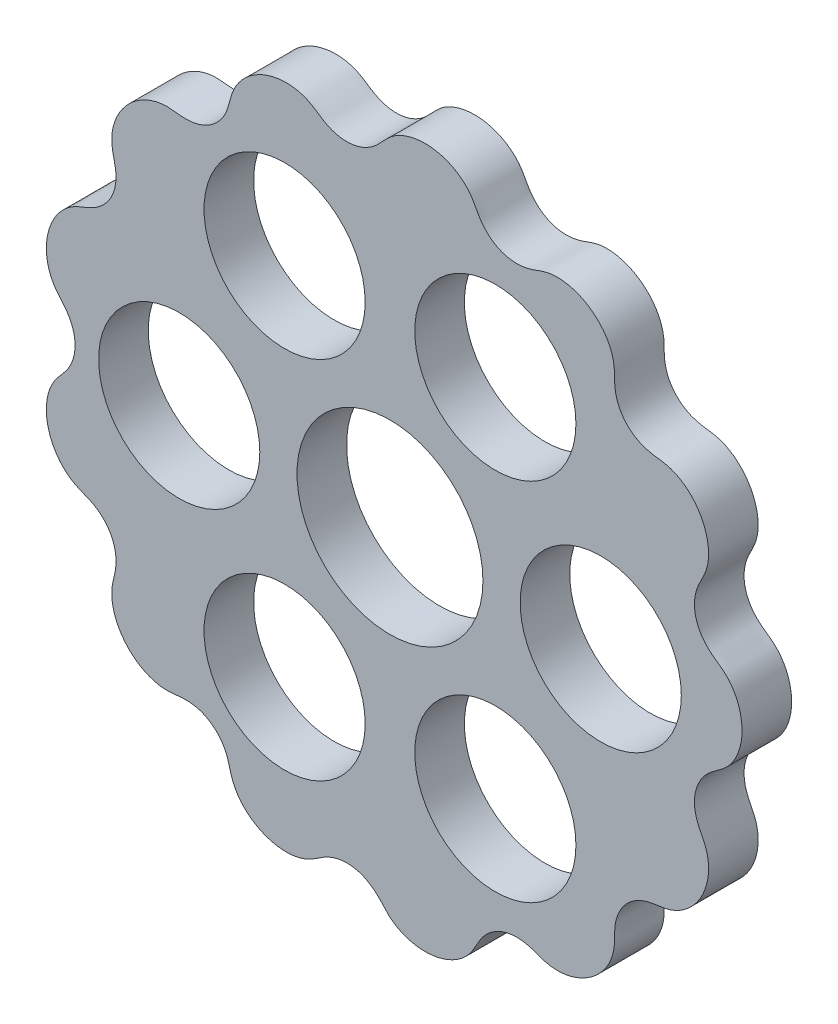
ISO-10303-21;
HEADER;
FILE_DESCRIPTION(('STEP AP214'),'2;1');
FILE_NAME('part.step','',(''),(''),'','','');
FILE_SCHEMA(('AUTOMOTIVE_DESIGN { 1 0 10303 214 1 1 1 1 }'));
ENDSEC;
DATA;
#1=APPLICATION_CONTEXT('core data for automotive mechanical design processes');
#2=APPLICATION_PROTOCOL_DEFINITION('international standard','automotive_design',2000,#1);
#3=PRODUCT_CONTEXT('',#1,'mechanical');
#4=PRODUCT('Part','Part','',(#3));
#5=PRODUCT_RELATED_PRODUCT_CATEGORY('part','',(#4));
#6=PRODUCT_DEFINITION_FORMATION('','',#4);
#7=PRODUCT_DEFINITION_CONTEXT('part definition',#1,'design');
#8=PRODUCT_DEFINITION('design','',#6,#7);
#9=PRODUCT_DEFINITION_SHAPE('','',#8);
#10=(LENGTH_UNIT() NAMED_UNIT(*) SI_UNIT(.MILLI.,.METRE.));
#11=(NAMED_UNIT(*) PLANE_ANGLE_UNIT() SI_UNIT($,.RADIAN.));
#12=(NAMED_UNIT(*) SI_UNIT($,.STERADIAN.) SOLID_ANGLE_UNIT());
#13=UNCERTAINTY_MEASURE_WITH_UNIT(LENGTH_MEASURE(1.E-05),#10,'distance_accuracy_value','');
#14=(GEOMETRIC_REPRESENTATION_CONTEXT(3) GLOBAL_UNCERTAINTY_ASSIGNED_CONTEXT((#13)) GLOBAL_UNIT_ASSIGNED_CONTEXT((#10,
#11,#12)) REPRESENTATION_CONTEXT('',''));
#15=CARTESIAN_POINT('',(0.,0.,0.));
#16=DIRECTION('',(0.,0.,1.));
#17=DIRECTION('',(1.,0.,0.));
#18=AXIS2_PLACEMENT_3D('',#15,#16,#17);
#19=CARTESIAN_POINT('',(0.,0.,-2.));
#20=DIRECTION('',(0.,0.,1.));
#21=DIRECTION('',(1.,0.,0.));
#22=AXIS2_PLACEMENT_3D('',#19,#20,#21);
#23=CYLINDRICAL_SURFACE('',#22,7.5);
#24=CARTESIAN_POINT('',(0.,0.,-2.));
#25=DIRECTION('',(0.,0.,1.));
#26=DIRECTION('',(1.,0.,0.));
#27=AXIS2_PLACEMENT_3D('',#24,#25,#26);
#28=CIRCLE('',#27,7.5);
#29=CARTESIAN_POINT('',(7.5,0.,-2.));
#30=VERTEX_POINT('',#29);
#31=EDGE_CURVE('E46',#30,#30,#28,.T.);
#32=ORIENTED_EDGE('',*,*,#31,.F.);
#33=EDGE_LOOP('',(#32));
#34=FACE_BOUND('',#33,.T.);
#35=CARTESIAN_POINT('',(0.,0.,2.));
#36=DIRECTION('',(0.,0.,1.));
#37=DIRECTION('',(1.,0.,0.));
#38=AXIS2_PLACEMENT_3D('',#35,#36,#37);
#39=CIRCLE('',#38,7.5);
#40=CARTESIAN_POINT('',(7.5,0.,2.));
#41=VERTEX_POINT('',#40);
#42=EDGE_CURVE('E54',#41,#41,#39,.T.);
#43=ORIENTED_EDGE('',*,*,#42,.T.);
#44=EDGE_LOOP('',(#43));
#45=FACE_BOUND('',#44,.T.);
#46=ADVANCED_FACE('F37',(#34,#45),#23,.F.);
#47=CARTESIAN_POINT('',(28.4,0.,-2.));
#48=CARTESIAN_POINT('',(28.4,0.494018077281395,-2.));
#49=CARTESIAN_POINT('',(28.2517724346192,1.48205423184421,-2.));
#50=CARTESIAN_POINT('',(27.6940320593812,2.59998380389546,-2.));
#51=CARTESIAN_POINT('',(27.0326537341155,3.33330206625649,-2.));
#52=CARTESIAN_POINT('',(26.4327038249563,3.76639091586571,-2.));
#53=CARTESIAN_POINT('',(25.8028305162469,4.21167996453306,-2.));
#54=CARTESIAN_POINT('',(25.0819444237052,4.96360035052576,-2.));
#55=CARTESIAN_POINT('',(24.5147666867307,6.17058970948249,-2.));
#56=CARTESIAN_POINT('',(24.5501305270848,7.50250682094075,-2.));
#57=CARTESIAN_POINT('',(24.9011449356945,8.48137310770468,-2.));
#58=CARTESIAN_POINT('',(25.2701093406554,9.14903736477961,-2.));
#59=CARTESIAN_POINT('',(25.5567310805582,9.82708911151464,-2.));
#60=CARTESIAN_POINT('',(25.7457657256968,10.7977462594145,-2.));
#61=CARTESIAN_POINT('',(25.6569104299972,12.0433792911543,-2.));
#62=CARTESIAN_POINT('',(25.1003773725293,13.4350656708568,-2.));
#63=CARTESIAN_POINT('',(24.1598672226639,14.601149783571,-2.));
#64=CARTESIAN_POINT('',(23.1091287756582,15.28026952895,-2.));
#65=CARTESIAN_POINT('',(22.165863427164,15.5619447413085,-2.));
#66=CARTESIAN_POINT('',(21.4207175620141,15.6381577607555,-2.));
#67=CARTESIAN_POINT('',(20.6571861407886,15.7805884524401,-2.));
#68=CARTESIAN_POINT('',(19.6916581459578,16.1744363515132,-2.));
#69=CARTESIAN_POINT('',(18.6880160972355,17.0542141669908,-2.));
#70=CARTESIAN_POINT('',(18.1853283232136,18.28671261616,-2.));
#71=CARTESIAN_POINT('',(18.1047484392748,19.3204651168975,-2.));
#72=CARTESIAN_POINT('',(18.1303586449653,20.3218599615977,-2.));
#73=CARTESIAN_POINT('',(17.8205598125879,21.52380408712,-2.));
#74=CARTESIAN_POINT('',(16.9646785406964,22.7589951275974,-2.));
#75=CARTESIAN_POINT('',(15.7829219409689,23.6790016408428,-2.));
#76=CARTESIAN_POINT('',(14.3819461383799,24.2090092367497,-2.));
#77=CARTESIAN_POINT('',(13.1300926865018,24.2577596435127,-2.));
#78=CARTESIAN_POINT('',(12.1810863494968,24.0046717733021,-2.));
#79=CARTESIAN_POINT('',(11.2435829984023,23.6187020546368,-2.));
#80=CARTESIAN_POINT('',(9.93167918205197,23.4168336593233,-2.));
#81=CARTESIAN_POINT('',(8.40531468409649,23.9059532038584,-2.));
#82=CARTESIAN_POINT('',(7.2536008003107,25.0202156753736,-2.));
#83=CARTESIAN_POINT('',(6.65781073486349,26.4352536418206,-2.));
#84=CARTESIAN_POINT('',(5.58550411767659,27.4731005514271,-2.));
#85=CARTESIAN_POINT('',(4.22473642780317,28.1054807821007,-2.));
#86=CARTESIAN_POINT('',(2.73931808605094,28.3034126928115,-2.));
#87=CARTESIAN_POINT('',(1.26309861730961,28.0487911923057,-2.));
#88=CARTESIAN_POINT('',(-0.0579384495987002,27.3398073977258,-2.));
#89=CARTESIAN_POINT('',(-0.972568048774349,26.1195473090616,-2.));
#90=CARTESIAN_POINT('',(-2.32031564634968,25.259891663065,-2.));
#91=CARTESIAN_POINT('',(-3.91610980276082,25.0965211150815,-2.));
#92=CARTESIAN_POINT('',(-5.16043650832356,25.5604944507025,-2.));
#93=CARTESIAN_POINT('',(-5.98983150818873,26.1551322010955,-2.));
#94=CARTESIAN_POINT('',(-6.83460851609718,26.6572297679366,-2.));
#95=CARTESIAN_POINT('',(-8.05482579975422,26.9417243532921,-2.));
#96=CARTESIAN_POINT('',(-9.54574239600177,26.7977513229155,-2.));
#97=CARTESIAN_POINT('',(-10.9268195391618,26.2189467191188,-2.));
#98=CARTESIAN_POINT('',(-12.0777775140771,25.2512532424679,-2.));
#99=CARTESIAN_POINT('',(-12.8192772328903,23.9644998701697,-2.));
#100=CARTESIAN_POINT('',(-13.0669075977899,22.4403810481019,-2.));
#101=CARTESIAN_POINT('',(-13.9736727882185,21.1129791788216,-2.));
#102=CARTESIAN_POINT('',(-15.1331537094872,20.4578046976219,-2.));
#103=CARTESIAN_POINT('',(-16.1602585199246,20.2726481980158,-2.));
#104=CARTESIAN_POINT('',(-16.9382994951821,20.2939433020603,-2.));
#105=CARTESIAN_POINT('',(-17.6847015044038,20.4048737956405,-2.));
#106=CARTESIAN_POINT('',(-18.6675217294585,20.3903379666938,-2.));
#107=CARTESIAN_POINT('',(-19.8612942479327,20.0124067043544,-2.));
#108=CARTESIAN_POINT('',(-21.0742363187852,19.1337367020819,-2.));
#109=CARTESIAN_POINT('',(-21.9753199349905,17.9359794512057,-2.));
#110=CARTESIAN_POINT('',(-22.3893575732058,16.7577106123276,-2.));
#111=CARTESIAN_POINT('',(-22.4656166365364,15.7717338631668,-2.));
#112=CARTESIAN_POINT('',(-22.3747024945202,15.0410950336727,-2.));
#113=CARTESIAN_POINT('',(-22.1737358919923,14.3107334085974,-2.));
#114=CARTESIAN_POINT('',(-22.0351275137155,13.2814882691664,-2.));
#115=CARTESIAN_POINT('',(-22.273967408101,11.9712983230022,-2.));
#116=CARTESIAN_POINT('',(-23.0763170300469,10.9053690535316,-2.));
#117=CARTESIAN_POINT('',(-23.9384383727396,10.319681802801,-2.));
#118=CARTESIAN_POINT('',(-24.6522536039025,10.0193729925573,-2.));
#119=CARTESIAN_POINT('',(-25.348564350697,9.75736724708988,-2.));
#120=CARTESIAN_POINT('',(-26.1817744874132,9.22998043071449,-2.));
#121=CARTESIAN_POINT('',(-27.0153137200926,8.29834863411906,-2.));
#122=CARTESIAN_POINT('',(-27.6177348048837,6.92636825511127,-2.));
#123=CARTESIAN_POINT('',(-27.7909028854273,5.43763049361172,-2.));
#124=CARTESIAN_POINT('',(-27.5480338575396,4.212558351681,-2.));
#125=CARTESIAN_POINT('',(-27.1069278033468,3.32798364018357,-2.));
#126=CARTESIAN_POINT('',(-26.6464688922434,2.75215312610548,-2.));
#127=CARTESIAN_POINT('',(-26.1327199887346,2.18195069299585,-2.));
#128=CARTESIAN_POINT('',(-25.5847273042694,1.29696627175968,-2.));
#129=CARTESIAN_POINT('',(-25.2768484638204,0.,-2.));
#130=CARTESIAN_POINT('',(-25.5847273042694,-1.29696627175966,-2.));
#131=CARTESIAN_POINT('',(-26.1327199887346,-2.18195069299582,-2.));
#132=CARTESIAN_POINT('',(-26.6464688922433,-2.75215312610543,-2.));
#133=CARTESIAN_POINT('',(-27.1069278033468,-3.32798364018352,-2.));
#134=CARTESIAN_POINT('',(-27.5480338575396,-4.21255835168104,-2.));
#135=CARTESIAN_POINT('',(-27.7909028854273,-5.43763049361169,-2.));
#136=CARTESIAN_POINT('',(-27.6177348048837,-6.92636825511128,-2.));
#137=CARTESIAN_POINT('',(-27.0153137200926,-8.29834863411904,-2.));
#138=CARTESIAN_POINT('',(-26.1817744874132,-9.22998043071452,-2.));
#139=CARTESIAN_POINT('',(-25.348564350697,-9.75736724708987,-2.));
#140=CARTESIAN_POINT('',(-24.6522536039025,-10.0193729925573,-2.));
#141=CARTESIAN_POINT('',(-23.9384383727395,-10.319681802801,-2.));
#142=CARTESIAN_POINT('',(-23.0763170300469,-10.9053690535316,-2.));
#143=CARTESIAN_POINT('',(-22.273967408101,-11.9712983230022,-2.));
#144=CARTESIAN_POINT('',(-22.0351275137155,-13.2814882691664,-2.));
#145=CARTESIAN_POINT('',(-22.1737358919923,-14.3107334085974,-2.));
#146=CARTESIAN_POINT('',(-22.3747024945202,-15.0410950336727,-2.));
#147=CARTESIAN_POINT('',(-22.4656166365364,-15.7717338631668,-2.));
#148=CARTESIAN_POINT('',(-22.3893575732058,-16.7577106123276,-2.));
#149=CARTESIAN_POINT('',(-21.9753199349905,-17.9359794512058,-2.));
#150=CARTESIAN_POINT('',(-21.0742363187852,-19.1337367020819,-2.));
#151=CARTESIAN_POINT('',(-19.8612942479327,-20.0124067043545,-2.));
#152=CARTESIAN_POINT('',(-18.6675217294584,-20.3903379666938,-2.));
#153=CARTESIAN_POINT('',(-17.6847015044037,-20.4048737956405,-2.));
#154=CARTESIAN_POINT('',(-16.9382994951821,-20.2939433020603,-2.));
#155=CARTESIAN_POINT('',(-16.1602585199246,-20.2726481980158,-2.));
#156=CARTESIAN_POINT('',(-15.1331537094871,-20.4578046976219,-2.));
#157=CARTESIAN_POINT('',(-13.9736727882184,-21.1129791788216,-2.));
#158=CARTESIAN_POINT('',(-13.0669075977899,-22.440381048102,-2.));
#159=CARTESIAN_POINT('',(-12.8192772328902,-23.9644998701698,-2.));
#160=CARTESIAN_POINT('',(-12.0777775140771,-25.2512532424679,-2.));
#161=CARTESIAN_POINT('',(-10.9268195391617,-26.2189467191188,-2.));
#162=CARTESIAN_POINT('',(-9.54574239600168,-26.7977513229155,-2.));
#163=CARTESIAN_POINT('',(-8.05482579975419,-26.9417243532921,-2.));
#164=CARTESIAN_POINT('',(-6.83460851609709,-26.6572297679366,-2.));
#165=CARTESIAN_POINT('',(-5.98983150818869,-26.1551322010954,-2.));
#166=CARTESIAN_POINT('',(-5.16043650832355,-25.5604944507025,-2.));
#167=CARTESIAN_POINT('',(-3.91610980276076,-25.0965211150815,-2.));
#168=CARTESIAN_POINT('',(-2.32031564634966,-25.259891663065,-2.));
#169=CARTESIAN_POINT('',(-0.972568048774323,-26.1195473090616,-2.));
#170=CARTESIAN_POINT('',(-0.0579384495986571,-27.3398073977258,-2.));
#171=CARTESIAN_POINT('',(1.26309861730962,-28.0487911923057,-2.));
#172=CARTESIAN_POINT('',(2.73931808605102,-28.3034126928115,-2.));
#173=CARTESIAN_POINT('',(4.22473642780324,-28.1054807821007,-2.));
#174=CARTESIAN_POINT('',(5.58550411767664,-27.473100551427,-2.));
#175=CARTESIAN_POINT('',(6.65781073486357,-26.4352536418205,-2.));
#176=CARTESIAN_POINT('',(7.25360080031074,-25.0202156753735,-2.));
#177=CARTESIAN_POINT('',(8.40531468409658,-23.9059532038583,-2.));
#178=CARTESIAN_POINT('',(9.93167918205204,-23.4168336593232,-2.));
#179=CARTESIAN_POINT('',(11.2435829984024,-23.6187020546369,-2.));
#180=CARTESIAN_POINT('',(12.1810863494969,-24.0046717733021,-2.));
#181=CARTESIAN_POINT('',(13.1300926865019,-24.2577596435128,-2.));
#182=CARTESIAN_POINT('',(14.38194613838,-24.2090092367497,-2.));
#183=CARTESIAN_POINT('',(15.782921940969,-23.6790016408428,-2.));
#184=CARTESIAN_POINT('',(16.9646785406965,-22.7589951275973,-2.));
#185=CARTESIAN_POINT('',(17.820559812588,-21.5238040871198,-2.));
#186=CARTESIAN_POINT('',(18.1303586449652,-20.3218599615976,-2.));
#187=CARTESIAN_POINT('',(18.1047484392748,-19.3204651168975,-2.));
#188=CARTESIAN_POINT('',(18.1853283232136,-18.2867126161599,-2.));
#189=CARTESIAN_POINT('',(18.6880160972356,-17.0542141669908,-2.));
#190=CARTESIAN_POINT('',(19.6916581459579,-16.1744363515132,-2.));
#191=CARTESIAN_POINT('',(20.6571861407887,-15.7805884524401,-2.));
#192=CARTESIAN_POINT('',(21.4207175620142,-15.6381577607554,-2.));
#193=CARTESIAN_POINT('',(22.1658634271641,-15.5619447413085,-2.));
#194=CARTESIAN_POINT('',(23.1091287756582,-15.28026952895,-2.));
#195=CARTESIAN_POINT('',(24.1598672226639,-14.601149783571,-2.));
#196=CARTESIAN_POINT('',(25.1003773725293,-13.4350656708568,-2.));
#197=CARTESIAN_POINT('',(25.6569104299971,-12.0433792911542,-2.));
#198=CARTESIAN_POINT('',(25.7457657256968,-10.7977462594146,-2.));
#199=CARTESIAN_POINT('',(25.5567310805582,-9.82708911151456,-2.));
#200=CARTESIAN_POINT('',(25.2701093406554,-9.1490373647796,-2.));
#201=CARTESIAN_POINT('',(24.9011449356945,-8.48137310770465,-2.));
#202=CARTESIAN_POINT('',(24.5501305270848,-7.50250682094073,-2.));
#203=CARTESIAN_POINT('',(24.5147666867307,-6.17058970948242,-2.));
#204=CARTESIAN_POINT('',(25.0819444237052,-4.96360035052574,-2.));
#205=CARTESIAN_POINT('',(25.802830516247,-4.21167996453302,-2.));
#206=CARTESIAN_POINT('',(26.4327038249564,-3.76639091586571,-2.));
#207=CARTESIAN_POINT('',(27.0326537341156,-3.33330206625644,-2.));
#208=CARTESIAN_POINT('',(27.6940320593811,-2.59998380389545,-2.));
#209=CARTESIAN_POINT('',(28.2517724346192,-1.48205423184416,-2.));
#210=CARTESIAN_POINT('',(28.4,-0.494018077281395,-2.));
#211=CARTESIAN_POINT('',(28.4,0.,-2.));
#212=B_SPLINE_CURVE_WITH_KNOTS('',3,(#47,#48,#49,#50,#51,#52,#53,#54,#55,#56,#57,#58,#59,#60,
#61,#62,#63,#64,#65,#66,#67,#68,#69,#70,#71,#72,#73,#74,#75,#76,#77,#78,#79,#80,#81,#82,#83,#84,
#85,#86,#87,#88,#89,#90,#91,#92,#93,#94,#95,#96,#97,#98,#99,#100,#101,#102,#103,#104,#105,#106,
#107,#108,#109,#110,#111,#112,#113,#114,#115,#116,#117,#118,#119,#120,#121,#122,#123,#124,#125,
#126,#127,#128,#129,#130,#131,#132,#133,#134,#135,#136,#137,#138,#139,#140,#141,#142,#143,#144,
#145,#146,#147,#148,#149,#150,#151,#152,#153,#154,#155,#156,#157,#158,#159,#160,#161,#162,#163,
#164,#165,#166,#167,#168,#169,#170,#171,#172,#173,#174,#175,#176,#177,#178,#179,#180,#181,#182,
#183,#184,#185,#186,#187,#188,#189,#190,#191,#192,#193,#194,#195,#196,#197,#198,#199,#200,#201,
#202,#203,#204,#205,#206,#207,#208,#209,#210,#211),.UNSPECIFIED.,.T.,.F.,(4,1,1,1,1,1,1,1,1,1,1,
1,1,1,1,1,1,1,1,1,1,1,1,1,1,1,1,1,1,1,1,1,1,1,1,1,1,1,1,1,1,1,1,1,1,1,1,1,1,1,1,1,1,1,1,1,1,1,1,
1,1,1,1,1,1,1,1,1,1,1,1,1,1,1,1,1,1,1,1,1,1,1,1,1,1,1,1,1,1,1,1,1,1,1,1,1,1,1,1,1,1,1,1,1,1,1,1,
1,1,1,1,1,1,1,1,1,1,1,1,1,1,1,1,1,1,1,1,1,1,1,1,1,1,1,1,1,1,1,1,1,1,1,1,1,1,1,1,1,1,1,1,1,1,1,1,
1,1,1,1,1,1,1,4),(0.,0.0078125,0.015625,0.01953125,0.0234375,0.02734375,0.03125,0.0390625,
0.046875,0.05078125,0.0546875,0.05859375,0.0625,0.0703125,0.078125,0.0859375,0.09375,0.09765625,
0.1015625,0.10546875,0.109375,0.1171875,0.125,0.12890625,0.1328125,0.140625,0.1484375,0.15625,
0.1640625,0.171875,0.17578125,0.1796875,0.1875,0.1953125,0.203125,0.2109375,0.21875,0.2265625,
0.234375,0.2421875,0.25,0.2578125,0.265625,0.2734375,0.28125,0.28515625,0.2890625,0.296875,
0.3046875,0.3125,0.3203125,0.328125,0.3359375,0.34375,0.3515625,0.35546875,0.359375,0.36328125,
0.3671875,0.375,0.3828125,0.390625,0.3984375,0.40234375,0.40625,0.41015625,0.4140625,0.421875,
0.4296875,0.43359375,0.4375,0.44140625,0.4453125,0.453125,0.4609375,0.46875,0.4765625,
0.48046875,0.484375,0.48828125,0.4921875,0.5,0.5078125,0.51171875,0.515625,0.51953125,0.5234375,
0.53125,0.5390625,0.546875,0.5546875,0.55859375,0.5625,0.56640625,0.5703125,0.578125,0.5859375,
0.58984375,0.59375,0.59765625,0.6015625,0.609375,0.6171875,0.625,0.6328125,0.63671875,0.640625,
0.64453125,0.6484375,0.65625,0.6640625,0.671875,0.6796875,0.6875,0.6953125,0.703125,0.7109375,
0.71484375,0.71875,0.7265625,0.734375,0.7421875,0.75,0.7578125,0.765625,0.7734375,0.78125,
0.7890625,0.796875,0.8046875,0.8125,0.8203125,0.82421875,0.828125,0.8359375,0.84375,0.8515625,
0.859375,0.8671875,0.87109375,0.875,0.8828125,0.890625,0.89453125,0.8984375,0.90234375,0.90625,
0.9140625,0.921875,0.9296875,0.9375,0.94140625,0.9453125,0.94921875,0.953125,0.9609375,0.96875,
0.97265625,0.9765625,0.98046875,0.984375,0.9921875,1.),.UNSPECIFIED.);
#213=DIRECTION('',(0.,0.,1.));
#214=VECTOR('',#213,1.);
#215=SURFACE_OF_LINEAR_EXTRUSION('',#212,#214);
#216=CARTESIAN_POINT('',(28.4,0.,-2.));
#217=VERTEX_POINT('',#216);
#218=EDGE_CURVE('E10',#217,#217,#212,.T.);
#219=ORIENTED_EDGE('',*,*,#218,.T.);
#220=EDGE_LOOP('',(#219));
#221=FACE_BOUND('',#220,.T.);
#222=CARTESIAN_POINT('',(28.4,0.,2.));
#223=CARTESIAN_POINT('',(28.4,0.494018077281395,2.));
#224=CARTESIAN_POINT('',(28.2517724346192,1.48205423184421,2.));
#225=CARTESIAN_POINT('',(27.6940320593812,2.59998380389546,2.));
#226=CARTESIAN_POINT('',(27.0326537341155,3.33330206625649,2.));
#227=CARTESIAN_POINT('',(26.4327038249563,3.76639091586571,2.));
#228=CARTESIAN_POINT('',(25.8028305162469,4.21167996453306,2.));
#229=CARTESIAN_POINT('',(25.0819444237052,4.96360035052576,2.));
#230=CARTESIAN_POINT('',(24.5147666867307,6.17058970948249,2.));
#231=CARTESIAN_POINT('',(24.5501305270848,7.50250682094075,2.));
#232=CARTESIAN_POINT('',(24.9011449356945,8.48137310770468,2.));
#233=CARTESIAN_POINT('',(25.2701093406554,9.14903736477961,2.));
#234=CARTESIAN_POINT('',(25.5567310805582,9.82708911151464,2.));
#235=CARTESIAN_POINT('',(25.7457657256968,10.7977462594145,2.));
#236=CARTESIAN_POINT('',(25.6569104299972,12.0433792911543,2.));
#237=CARTESIAN_POINT('',(25.1003773725293,13.4350656708568,2.));
#238=CARTESIAN_POINT('',(24.1598672226639,14.601149783571,2.));
#239=CARTESIAN_POINT('',(23.1091287756582,15.28026952895,2.));
#240=CARTESIAN_POINT('',(22.165863427164,15.5619447413085,2.));
#241=CARTESIAN_POINT('',(21.4207175620141,15.6381577607555,2.));
#242=CARTESIAN_POINT('',(20.6571861407886,15.7805884524401,2.));
#243=CARTESIAN_POINT('',(19.6916581459578,16.1744363515132,2.));
#244=CARTESIAN_POINT('',(18.6880160972355,17.0542141669908,2.));
#245=CARTESIAN_POINT('',(18.1853283232136,18.28671261616,2.));
#246=CARTESIAN_POINT('',(18.1047484392748,19.3204651168975,2.));
#247=CARTESIAN_POINT('',(18.1303586449653,20.3218599615977,2.));
#248=CARTESIAN_POINT('',(17.8205598125879,21.52380408712,2.));
#249=CARTESIAN_POINT('',(16.9646785406964,22.7589951275974,2.));
#250=CARTESIAN_POINT('',(15.7829219409689,23.6790016408428,2.));
#251=CARTESIAN_POINT('',(14.3819461383799,24.2090092367497,2.));
#252=CARTESIAN_POINT('',(13.1300926865018,24.2577596435127,2.));
#253=CARTESIAN_POINT('',(12.1810863494968,24.0046717733021,2.));
#254=CARTESIAN_POINT('',(11.2435829984023,23.6187020546368,2.));
#255=CARTESIAN_POINT('',(9.93167918205197,23.4168336593233,2.));
#256=CARTESIAN_POINT('',(8.40531468409649,23.9059532038584,2.));
#257=CARTESIAN_POINT('',(7.2536008003107,25.0202156753736,2.));
#258=CARTESIAN_POINT('',(6.65781073486349,26.4352536418206,2.));
#259=CARTESIAN_POINT('',(5.58550411767659,27.4731005514271,2.));
#260=CARTESIAN_POINT('',(4.22473642780317,28.1054807821007,2.));
#261=CARTESIAN_POINT('',(2.73931808605094,28.3034126928115,2.));
#262=CARTESIAN_POINT('',(1.26309861730961,28.0487911923057,2.));
#263=CARTESIAN_POINT('',(-0.0579384495987002,27.3398073977258,2.));
#264=CARTESIAN_POINT('',(-0.972568048774349,26.1195473090616,2.));
#265=CARTESIAN_POINT('',(-2.32031564634968,25.259891663065,2.));
#266=CARTESIAN_POINT('',(-3.91610980276082,25.0965211150815,2.));
#267=CARTESIAN_POINT('',(-5.16043650832356,25.5604944507025,2.));
#268=CARTESIAN_POINT('',(-5.98983150818873,26.1551322010955,2.));
#269=CARTESIAN_POINT('',(-6.83460851609718,26.6572297679366,2.));
#270=CARTESIAN_POINT('',(-8.05482579975422,26.9417243532921,2.));
#271=CARTESIAN_POINT('',(-9.54574239600177,26.7977513229155,2.));
#272=CARTESIAN_POINT('',(-10.9268195391618,26.2189467191188,2.));
#273=CARTESIAN_POINT('',(-12.0777775140771,25.2512532424679,2.));
#274=CARTESIAN_POINT('',(-12.8192772328903,23.9644998701697,2.));
#275=CARTESIAN_POINT('',(-13.0669075977899,22.4403810481019,2.));
#276=CARTESIAN_POINT('',(-13.9736727882185,21.1129791788216,2.));
#277=CARTESIAN_POINT('',(-15.1331537094872,20.4578046976219,2.));
#278=CARTESIAN_POINT('',(-16.1602585199246,20.2726481980158,2.));
#279=CARTESIAN_POINT('',(-16.9382994951821,20.2939433020603,2.));
#280=CARTESIAN_POINT('',(-17.6847015044038,20.4048737956405,2.));
#281=CARTESIAN_POINT('',(-18.6675217294585,20.3903379666938,2.));
#282=CARTESIAN_POINT('',(-19.8612942479327,20.0124067043544,2.));
#283=CARTESIAN_POINT('',(-21.0742363187852,19.1337367020819,2.));
#284=CARTESIAN_POINT('',(-21.9753199349905,17.9359794512057,2.));
#285=CARTESIAN_POINT('',(-22.3893575732058,16.7577106123276,2.));
#286=CARTESIAN_POINT('',(-22.4656166365364,15.7717338631668,2.));
#287=CARTESIAN_POINT('',(-22.3747024945202,15.0410950336727,2.));
#288=CARTESIAN_POINT('',(-22.1737358919923,14.3107334085974,2.));
#289=CARTESIAN_POINT('',(-22.0351275137155,13.2814882691664,2.));
#290=CARTESIAN_POINT('',(-22.273967408101,11.9712983230022,2.));
#291=CARTESIAN_POINT('',(-23.0763170300469,10.9053690535316,2.));
#292=CARTESIAN_POINT('',(-23.9384383727396,10.319681802801,2.));
#293=CARTESIAN_POINT('',(-24.6522536039025,10.0193729925573,2.));
#294=CARTESIAN_POINT('',(-25.348564350697,9.75736724708988,2.));
#295=CARTESIAN_POINT('',(-26.1817744874132,9.22998043071449,2.));
#296=CARTESIAN_POINT('',(-27.0153137200926,8.29834863411906,2.));
#297=CARTESIAN_POINT('',(-27.6177348048837,6.92636825511127,2.));
#298=CARTESIAN_POINT('',(-27.7909028854273,5.43763049361172,2.));
#299=CARTESIAN_POINT('',(-27.5480338575396,4.212558351681,2.));
#300=CARTESIAN_POINT('',(-27.1069278033468,3.32798364018357,2.));
#301=CARTESIAN_POINT('',(-26.6464688922434,2.75215312610548,2.));
#302=CARTESIAN_POINT('',(-26.1327199887346,2.18195069299585,2.));
#303=CARTESIAN_POINT('',(-25.5847273042694,1.29696627175968,2.));
#304=CARTESIAN_POINT('',(-25.2768484638204,0.,2.));
#305=CARTESIAN_POINT('',(-25.5847273042694,-1.29696627175966,2.));
#306=CARTESIAN_POINT('',(-26.1327199887346,-2.18195069299582,2.));
#307=CARTESIAN_POINT('',(-26.6464688922433,-2.75215312610543,2.));
#308=CARTESIAN_POINT('',(-27.1069278033468,-3.32798364018352,2.));
#309=CARTESIAN_POINT('',(-27.5480338575396,-4.21255835168104,2.));
#310=CARTESIAN_POINT('',(-27.7909028854273,-5.43763049361169,2.));
#311=CARTESIAN_POINT('',(-27.6177348048837,-6.92636825511128,2.));
#312=CARTESIAN_POINT('',(-27.0153137200926,-8.29834863411904,2.));
#313=CARTESIAN_POINT('',(-26.1817744874132,-9.22998043071452,2.));
#314=CARTESIAN_POINT('',(-25.348564350697,-9.75736724708987,2.));
#315=CARTESIAN_POINT('',(-24.6522536039025,-10.0193729925573,2.));
#316=CARTESIAN_POINT('',(-23.9384383727395,-10.319681802801,2.));
#317=CARTESIAN_POINT('',(-23.0763170300469,-10.9053690535316,2.));
#318=CARTESIAN_POINT('',(-22.273967408101,-11.9712983230022,2.));
#319=CARTESIAN_POINT('',(-22.0351275137155,-13.2814882691664,2.));
#320=CARTESIAN_POINT('',(-22.1737358919923,-14.3107334085974,2.));
#321=CARTESIAN_POINT('',(-22.3747024945202,-15.0410950336727,2.));
#322=CARTESIAN_POINT('',(-22.4656166365364,-15.7717338631668,2.));
#323=CARTESIAN_POINT('',(-22.3893575732058,-16.7577106123276,2.));
#324=CARTESIAN_POINT('',(-21.9753199349905,-17.9359794512058,2.));
#325=CARTESIAN_POINT('',(-21.0742363187852,-19.1337367020819,2.));
#326=CARTESIAN_POINT('',(-19.8612942479327,-20.0124067043545,2.));
#327=CARTESIAN_POINT('',(-18.6675217294584,-20.3903379666938,2.));
#328=CARTESIAN_POINT('',(-17.6847015044037,-20.4048737956405,2.));
#329=CARTESIAN_POINT('',(-16.9382994951821,-20.2939433020603,2.));
#330=CARTESIAN_POINT('',(-16.1602585199246,-20.2726481980158,2.));
#331=CARTESIAN_POINT('',(-15.1331537094871,-20.4578046976219,2.));
#332=CARTESIAN_POINT('',(-13.9736727882184,-21.1129791788216,2.));
#333=CARTESIAN_POINT('',(-13.0669075977899,-22.440381048102,2.));
#334=CARTESIAN_POINT('',(-12.8192772328902,-23.9644998701698,2.));
#335=CARTESIAN_POINT('',(-12.0777775140771,-25.2512532424679,2.));
#336=CARTESIAN_POINT('',(-10.9268195391617,-26.2189467191188,2.));
#337=CARTESIAN_POINT('',(-9.54574239600168,-26.7977513229155,2.));
#338=CARTESIAN_POINT('',(-8.05482579975419,-26.9417243532921,2.));
#339=CARTESIAN_POINT('',(-6.83460851609709,-26.6572297679366,2.));
#340=CARTESIAN_POINT('',(-5.98983150818869,-26.1551322010954,2.));
#341=CARTESIAN_POINT('',(-5.16043650832355,-25.5604944507025,2.));
#342=CARTESIAN_POINT('',(-3.91610980276076,-25.0965211150815,2.));
#343=CARTESIAN_POINT('',(-2.32031564634966,-25.259891663065,2.));
#344=CARTESIAN_POINT('',(-0.972568048774323,-26.1195473090616,2.));
#345=CARTESIAN_POINT('',(-0.0579384495986571,-27.3398073977258,2.));
#346=CARTESIAN_POINT('',(1.26309861730962,-28.0487911923057,2.));
#347=CARTESIAN_POINT('',(2.73931808605102,-28.3034126928115,2.));
#348=CARTESIAN_POINT('',(4.22473642780324,-28.1054807821007,2.));
#349=CARTESIAN_POINT('',(5.58550411767664,-27.473100551427,2.));
#350=CARTESIAN_POINT('',(6.65781073486357,-26.4352536418205,2.));
#351=CARTESIAN_POINT('',(7.25360080031074,-25.0202156753735,2.));
#352=CARTESIAN_POINT('',(8.40531468409658,-23.9059532038583,2.));
#353=CARTESIAN_POINT('',(9.93167918205204,-23.4168336593232,2.));
#354=CARTESIAN_POINT('',(11.2435829984024,-23.6187020546369,2.));
#355=CARTESIAN_POINT('',(12.1810863494969,-24.0046717733021,2.));
#356=CARTESIAN_POINT('',(13.1300926865019,-24.2577596435128,2.));
#357=CARTESIAN_POINT('',(14.38194613838,-24.2090092367497,2.));
#358=CARTESIAN_POINT('',(15.782921940969,-23.6790016408428,2.));
#359=CARTESIAN_POINT('',(16.9646785406965,-22.7589951275973,2.));
#360=CARTESIAN_POINT('',(17.820559812588,-21.5238040871198,2.));
#361=CARTESIAN_POINT('',(18.1303586449652,-20.3218599615976,2.));
#362=CARTESIAN_POINT('',(18.1047484392748,-19.3204651168975,2.));
#363=CARTESIAN_POINT('',(18.1853283232136,-18.2867126161599,2.));
#364=CARTESIAN_POINT('',(18.6880160972356,-17.0542141669908,2.));
#365=CARTESIAN_POINT('',(19.6916581459579,-16.1744363515132,2.));
#366=CARTESIAN_POINT('',(20.6571861407887,-15.7805884524401,2.));
#367=CARTESIAN_POINT('',(21.4207175620142,-15.6381577607554,2.));
#368=CARTESIAN_POINT('',(22.1658634271641,-15.5619447413085,2.));
#369=CARTESIAN_POINT('',(23.1091287756582,-15.28026952895,2.));
#370=CARTESIAN_POINT('',(24.1598672226639,-14.601149783571,2.));
#371=CARTESIAN_POINT('',(25.1003773725293,-13.4350656708568,2.));
#372=CARTESIAN_POINT('',(25.6569104299971,-12.0433792911542,2.));
#373=CARTESIAN_POINT('',(25.7457657256968,-10.7977462594146,2.));
#374=CARTESIAN_POINT('',(25.5567310805582,-9.82708911151456,2.));
#375=CARTESIAN_POINT('',(25.2701093406554,-9.1490373647796,2.));
#376=CARTESIAN_POINT('',(24.9011449356945,-8.48137310770465,2.));
#377=CARTESIAN_POINT('',(24.5501305270848,-7.50250682094073,2.));
#378=CARTESIAN_POINT('',(24.5147666867307,-6.17058970948242,2.));
#379=CARTESIAN_POINT('',(25.0819444237052,-4.96360035052574,2.));
#380=CARTESIAN_POINT('',(25.802830516247,-4.21167996453302,2.));
#381=CARTESIAN_POINT('',(26.4327038249564,-3.76639091586571,2.));
#382=CARTESIAN_POINT('',(27.0326537341156,-3.33330206625644,2.));
#383=CARTESIAN_POINT('',(27.6940320593811,-2.59998380389545,2.));
#384=CARTESIAN_POINT('',(28.2517724346192,-1.48205423184416,2.));
#385=CARTESIAN_POINT('',(28.4,-0.494018077281395,2.));
#386=CARTESIAN_POINT('',(28.4,0.,2.));
#387=B_SPLINE_CURVE_WITH_KNOTS('',3,(#222,#223,#224,#225,#226,#227,#228,#229,#230,#231,#232,
#233,#234,#235,#236,#237,#238,#239,#240,#241,#242,#243,#244,#245,#246,#247,#248,#249,#250,#251,
#252,#253,#254,#255,#256,#257,#258,#259,#260,#261,#262,#263,#264,#265,#266,#267,#268,#269,#270,
#271,#272,#273,#274,#275,#276,#277,#278,#279,#280,#281,#282,#283,#284,#285,#286,#287,#288,#289,
#290,#291,#292,#293,#294,#295,#296,#297,#298,#299,#300,#301,#302,#303,#304,#305,#306,#307,#308,
#309,#310,#311,#312,#313,#314,#315,#316,#317,#318,#319,#320,#321,#322,#323,#324,#325,#326,#327,
#328,#329,#330,#331,#332,#333,#334,#335,#336,#337,#338,#339,#340,#341,#342,#343,#344,#345,#346,
#347,#348,#349,#350,#351,#352,#353,#354,#355,#356,#357,#358,#359,#360,#361,#362,#363,#364,#365,
#366,#367,#368,#369,#370,#371,#372,#373,#374,#375,#376,#377,#378,#379,#380,#381,#382,#383,#384,
#385,#386),.UNSPECIFIED.,.T.,.F.,(4,1,1,1,1,1,1,1,1,1,1,1,1,1,1,1,1,1,1,1,1,1,1,1,1,1,1,1,1,1,1,
1,1,1,1,1,1,1,1,1,1,1,1,1,1,1,1,1,1,1,1,1,1,1,1,1,1,1,1,1,1,1,1,1,1,1,1,1,1,1,1,1,1,1,1,1,1,1,1,
1,1,1,1,1,1,1,1,1,1,1,1,1,1,1,1,1,1,1,1,1,1,1,1,1,1,1,1,1,1,1,1,1,1,1,1,1,1,1,1,1,1,1,1,1,1,1,1,
1,1,1,1,1,1,1,1,1,1,1,1,1,1,1,1,1,1,1,1,1,1,1,1,1,1,1,1,1,1,1,1,1,1,1,4),(0.,0.0078125,0.015625,
0.01953125,0.0234375,0.02734375,0.03125,0.0390625,0.046875,0.05078125,0.0546875,0.05859375,
0.0625,0.0703125,0.078125,0.0859375,0.09375,0.09765625,0.1015625,0.10546875,0.109375,0.1171875,
0.125,0.12890625,0.1328125,0.140625,0.1484375,0.15625,0.1640625,0.171875,0.17578125,0.1796875,
0.1875,0.1953125,0.203125,0.2109375,0.21875,0.2265625,0.234375,0.2421875,0.25,0.2578125,
0.265625,0.2734375,0.28125,0.28515625,0.2890625,0.296875,0.3046875,0.3125,0.3203125,0.328125,
0.3359375,0.34375,0.3515625,0.35546875,0.359375,0.36328125,0.3671875,0.375,0.3828125,0.390625,
0.3984375,0.40234375,0.40625,0.41015625,0.4140625,0.421875,0.4296875,0.43359375,0.4375,
0.44140625,0.4453125,0.453125,0.4609375,0.46875,0.4765625,0.48046875,0.484375,0.48828125,
0.4921875,0.5,0.5078125,0.51171875,0.515625,0.51953125,0.5234375,0.53125,0.5390625,0.546875,
0.5546875,0.55859375,0.5625,0.56640625,0.5703125,0.578125,0.5859375,0.58984375,0.59375,
0.59765625,0.6015625,0.609375,0.6171875,0.625,0.6328125,0.63671875,0.640625,0.64453125,
0.6484375,0.65625,0.6640625,0.671875,0.6796875,0.6875,0.6953125,0.703125,0.7109375,0.71484375,
0.71875,0.7265625,0.734375,0.7421875,0.75,0.7578125,0.765625,0.7734375,0.78125,0.7890625,
0.796875,0.8046875,0.8125,0.8203125,0.82421875,0.828125,0.8359375,0.84375,0.8515625,0.859375,
0.8671875,0.87109375,0.875,0.8828125,0.890625,0.89453125,0.8984375,0.90234375,0.90625,0.9140625,
0.921875,0.9296875,0.9375,0.94140625,0.9453125,0.94921875,0.953125,0.9609375,0.96875,0.97265625,
0.9765625,0.98046875,0.984375,0.9921875,1.),.UNSPECIFIED.);
#388=CARTESIAN_POINT('',(28.4,0.,2.));
#389=VERTEX_POINT('',#388);
#390=EDGE_CURVE('E50',#389,#389,#387,.T.);
#391=ORIENTED_EDGE('',*,*,#390,.F.);
#392=EDGE_LOOP('',(#391));
#393=FACE_BOUND('',#392,.T.);
#394=ADVANCED_FACE('F117',(#221,#393),#215,.T.);
#395=CARTESIAN_POINT('',(0.,0.,-2.));
#396=DIRECTION('',(0.,0.,1.));
#397=DIRECTION('',(1.,0.,0.));
#398=AXIS2_PLACEMENT_3D('',#395,#396,#397);
#399=PLANE('',#398);
#400=CARTESIAN_POINT('',(8.49999999999997,-14.7224318643355,-2.));
#401=DIRECTION('',(0.,0.,1.));
#402=DIRECTION('',(1.,0.,0.));
#403=AXIS2_PLACEMENT_3D('',#400,#401,#402);
#404=CIRCLE('',#403,6.5);
#405=CARTESIAN_POINT('',(15.,-14.7224318643355,-2.));
#406=VERTEX_POINT('',#405);
#407=EDGE_CURVE('E64',#406,#406,#404,.T.);
#408=ORIENTED_EDGE('',*,*,#407,.T.);
#409=EDGE_LOOP('',(#408));
#410=FACE_BOUND('',#409,.T.);
#411=CARTESIAN_POINT('',(-8.50000000000007,-14.7224318643354,-2.));
#412=DIRECTION('',(0.,0.,1.));
#413=DIRECTION('',(1.,0.,0.));
#414=AXIS2_PLACEMENT_3D('',#411,#412,#413);
#415=CIRCLE('',#414,6.5);
#416=CARTESIAN_POINT('',(-2.00000000000007,-14.7224318643354,-2.));
#417=VERTEX_POINT('',#416);
#418=EDGE_CURVE('E67',#417,#417,#415,.T.);
#419=ORIENTED_EDGE('',*,*,#418,.T.);
#420=EDGE_LOOP('',(#419));
#421=FACE_BOUND('',#420,.T.);
#422=CARTESIAN_POINT('',(-17.,1.18710365520667E-13,-2.));
#423=DIRECTION('',(0.,0.,1.));
#424=DIRECTION('',(1.,0.,0.));
#425=AXIS2_PLACEMENT_3D('',#422,#423,#424);
#426=CIRCLE('',#425,6.5);
#427=CARTESIAN_POINT('',(-10.5,1.18710365520667E-13,-2.));
#428=VERTEX_POINT('',#427);
#429=EDGE_CURVE('E70',#428,#428,#426,.T.);
#430=ORIENTED_EDGE('',*,*,#429,.T.);
#431=EDGE_LOOP('',(#430));
#432=FACE_BOUND('',#431,.T.);
#433=CARTESIAN_POINT('',(-8.49999999999986,14.7224318643355,-2.));
#434=DIRECTION('',(0.,0.,1.));
#435=DIRECTION('',(1.,0.,0.));
#436=AXIS2_PLACEMENT_3D('',#433,#434,#435);
#437=CIRCLE('',#436,6.5);
#438=CARTESIAN_POINT('',(-1.99999999999986,14.7224318643355,-2.));
#439=VERTEX_POINT('',#438);
#440=EDGE_CURVE('E73',#439,#439,#437,.T.);
#441=ORIENTED_EDGE('',*,*,#440,.T.);
#442=EDGE_LOOP('',(#441));
#443=FACE_BOUND('',#442,.T.);
#444=CARTESIAN_POINT('',(8.50000000000017,14.7224318643354,-2.));
#445=DIRECTION('',(0.,0.,1.));
#446=DIRECTION('',(1.,0.,0.));
#447=AXIS2_PLACEMENT_3D('',#444,#445,#446);
#448=CIRCLE('',#447,6.5);
#449=CARTESIAN_POINT('',(15.0000000000002,14.7224318643354,-2.));
#450=VERTEX_POINT('',#449);
#451=EDGE_CURVE('E76',#450,#450,#448,.T.);
#452=ORIENTED_EDGE('',*,*,#451,.T.);
#453=EDGE_LOOP('',(#452));
#454=FACE_BOUND('',#453,.T.);
#455=CARTESIAN_POINT('',(17.,0.,-2.));
#456=DIRECTION('',(0.,0.,1.));
#457=DIRECTION('',(1.,0.,0.));
#458=AXIS2_PLACEMENT_3D('',#455,#456,#457);
#459=CIRCLE('',#458,6.5);
#460=CARTESIAN_POINT('',(23.5,0.,-2.));
#461=VERTEX_POINT('',#460);
#462=EDGE_CURVE('E79',#461,#461,#459,.T.);
#463=ORIENTED_EDGE('',*,*,#462,.T.);
#464=EDGE_LOOP('',(#463));
#465=FACE_BOUND('',#464,.T.);
#466=ORIENTED_EDGE('',*,*,#31,.T.);
#467=EDGE_LOOP('',(#466));
#468=FACE_BOUND('',#467,.T.);
#469=ORIENTED_EDGE('',*,*,#218,.F.);
#470=EDGE_LOOP('',(#469));
#471=FACE_BOUND('',#470,.T.);
#472=ADVANCED_FACE('F108',(#410,#421,#432,#443,#454,#465,#468,#471),#399,.F.);
#473=CARTESIAN_POINT('',(0.,0.,2.));
#474=DIRECTION('',(0.,0.,1.));
#475=DIRECTION('',(1.,0.,0.));
#476=AXIS2_PLACEMENT_3D('',#473,#474,#475);
#477=PLANE('',#476);
#478=CARTESIAN_POINT('',(8.49999999999997,-14.7224318643355,2.));
#479=DIRECTION('',(0.,0.,1.));
#480=DIRECTION('',(1.,0.,0.));
#481=AXIS2_PLACEMENT_3D('',#478,#479,#480);
#482=CIRCLE('',#481,6.5);
#483=CARTESIAN_POINT('',(15.,-14.7224318643355,2.));
#484=VERTEX_POINT('',#483);
#485=EDGE_CURVE('E85',#484,#484,#482,.T.);
#486=ORIENTED_EDGE('',*,*,#485,.F.);
#487=EDGE_LOOP('',(#486));
#488=FACE_BOUND('',#487,.T.);
#489=CARTESIAN_POINT('',(-8.50000000000007,-14.7224318643354,2.));
#490=DIRECTION('',(0.,0.,1.));
#491=DIRECTION('',(1.,0.,0.));
#492=AXIS2_PLACEMENT_3D('',#489,#490,#491);
#493=CIRCLE('',#492,6.5);
#494=CARTESIAN_POINT('',(-2.00000000000007,-14.7224318643354,2.));
#495=VERTEX_POINT('',#494);
#496=EDGE_CURVE('E93',#495,#495,#493,.T.);
#497=ORIENTED_EDGE('',*,*,#496,.F.);
#498=EDGE_LOOP('',(#497));
#499=FACE_BOUND('',#498,.T.);
#500=CARTESIAN_POINT('',(-17.,1.18710365520667E-13,2.));
#501=DIRECTION('',(0.,0.,1.));
#502=DIRECTION('',(1.,0.,0.));
#503=AXIS2_PLACEMENT_3D('',#500,#501,#502);
#504=CIRCLE('',#503,6.5);
#505=CARTESIAN_POINT('',(-10.5,1.18710365520667E-13,2.));
#506=VERTEX_POINT('',#505);
#507=EDGE_CURVE('E89',#506,#506,#504,.T.);
#508=ORIENTED_EDGE('',*,*,#507,.F.);
#509=EDGE_LOOP('',(#508));
#510=FACE_BOUND('',#509,.T.);
#511=CARTESIAN_POINT('',(-8.49999999999986,14.7224318643355,2.));
#512=DIRECTION('',(0.,0.,1.));
#513=DIRECTION('',(1.,0.,0.));
#514=AXIS2_PLACEMENT_3D('',#511,#512,#513);
#515=CIRCLE('',#514,6.5);
#516=CARTESIAN_POINT('',(-1.99999999999986,14.7224318643355,2.));
#517=VERTEX_POINT('',#516);
#518=EDGE_CURVE('E86',#517,#517,#515,.T.);
#519=ORIENTED_EDGE('',*,*,#518,.F.);
#520=EDGE_LOOP('',(#519));
#521=FACE_BOUND('',#520,.T.);
#522=CARTESIAN_POINT('',(8.50000000000017,14.7224318643354,2.));
#523=DIRECTION('',(0.,0.,1.));
#524=DIRECTION('',(1.,0.,0.));
#525=AXIS2_PLACEMENT_3D('',#522,#523,#524);
#526=CIRCLE('',#525,6.5);
#527=CARTESIAN_POINT('',(15.0000000000002,14.7224318643354,2.));
#528=VERTEX_POINT('',#527);
#529=EDGE_CURVE('E90',#528,#528,#526,.T.);
#530=ORIENTED_EDGE('',*,*,#529,.F.);
#531=EDGE_LOOP('',(#530));
#532=FACE_BOUND('',#531,.T.);
#533=CARTESIAN_POINT('',(17.,0.,2.));
#534=DIRECTION('',(0.,0.,1.));
#535=DIRECTION('',(1.,0.,0.));
#536=AXIS2_PLACEMENT_3D('',#533,#534,#535);
#537=CIRCLE('',#536,6.5);
#538=CARTESIAN_POINT('',(23.5,0.,2.));
#539=VERTEX_POINT('',#538);
#540=EDGE_CURVE('E82',#539,#539,#537,.T.);
#541=ORIENTED_EDGE('',*,*,#540,.F.);
#542=EDGE_LOOP('',(#541));
#543=FACE_BOUND('',#542,.T.);
#544=ORIENTED_EDGE('',*,*,#42,.F.);
#545=EDGE_LOOP('',(#544));
#546=FACE_BOUND('',#545,.T.);
#547=ORIENTED_EDGE('',*,*,#390,.T.);
#548=EDGE_LOOP('',(#547));
#549=FACE_BOUND('',#548,.T.);
#550=ADVANCED_FACE('F104',(#488,#499,#510,#521,#532,#543,#546,#549),#477,.T.);
#551=CARTESIAN_POINT('',(17.,0.,-8.));
#552=DIRECTION('',(0.,0.,1.));
#553=DIRECTION('',(1.,0.,0.));
#554=AXIS2_PLACEMENT_3D('',#551,#552,#553);
#555=CYLINDRICAL_SURFACE('',#554,6.5);
#556=ORIENTED_EDGE('',*,*,#540,.T.);
#557=EDGE_LOOP('',(#556));
#558=FACE_BOUND('',#557,.T.);
#559=ORIENTED_EDGE('',*,*,#462,.F.);
#560=EDGE_LOOP('',(#559));
#561=FACE_BOUND('',#560,.T.);
#562=ADVANCED_FACE('F107',(#558,#561),#555,.F.);
#563=CARTESIAN_POINT('',(8.50000000000017,14.7224318643354,-8.));
#564=DIRECTION('',(0.,0.,1.));
#565=DIRECTION('',(1.,0.,0.));
#566=AXIS2_PLACEMENT_3D('',#563,#564,#565);
#567=CYLINDRICAL_SURFACE('',#566,6.5);
#568=ORIENTED_EDGE('',*,*,#529,.T.);
#569=EDGE_LOOP('',(#568));
#570=FACE_BOUND('',#569,.T.);
#571=ORIENTED_EDGE('',*,*,#451,.F.);
#572=EDGE_LOOP('',(#571));
#573=FACE_BOUND('',#572,.T.);
#574=ADVANCED_FACE('F101',(#570,#573),#567,.F.);
#575=CARTESIAN_POINT('',(-8.49999999999986,14.7224318643355,-8.));
#576=DIRECTION('',(0.,0.,1.));
#577=DIRECTION('',(1.,0.,0.));
#578=AXIS2_PLACEMENT_3D('',#575,#576,#577);
#579=CYLINDRICAL_SURFACE('',#578,6.5);
#580=ORIENTED_EDGE('',*,*,#518,.T.);
#581=EDGE_LOOP('',(#580));
#582=FACE_BOUND('',#581,.T.);
#583=ORIENTED_EDGE('',*,*,#440,.F.);
#584=EDGE_LOOP('',(#583));
#585=FACE_BOUND('',#584,.T.);
#586=ADVANCED_FACE('F130',(#582,#585),#579,.F.);
#587=CARTESIAN_POINT('',(-17.,1.18710365520667E-13,-8.));
#588=DIRECTION('',(0.,0.,1.));
#589=DIRECTION('',(1.,0.,0.));
#590=AXIS2_PLACEMENT_3D('',#587,#588,#589);
#591=CYLINDRICAL_SURFACE('',#590,6.5);
#592=ORIENTED_EDGE('',*,*,#507,.T.);
#593=EDGE_LOOP('',(#592));
#594=FACE_BOUND('',#593,.T.);
#595=ORIENTED_EDGE('',*,*,#429,.F.);
#596=EDGE_LOOP('',(#595));
#597=FACE_BOUND('',#596,.T.);
#598=ADVANCED_FACE('F133',(#594,#597),#591,.F.);
#599=CARTESIAN_POINT('',(-8.50000000000007,-14.7224318643354,-8.));
#600=DIRECTION('',(0.,0.,1.));
#601=DIRECTION('',(1.,0.,0.));
#602=AXIS2_PLACEMENT_3D('',#599,#600,#601);
#603=CYLINDRICAL_SURFACE('',#602,6.5);
#604=ORIENTED_EDGE('',*,*,#496,.T.);
#605=EDGE_LOOP('',(#604));
#606=FACE_BOUND('',#605,.T.);
#607=ORIENTED_EDGE('',*,*,#418,.F.);
#608=EDGE_LOOP('',(#607));
#609=FACE_BOUND('',#608,.T.);
#610=ADVANCED_FACE('F137',(#606,#609),#603,.F.);
#611=CARTESIAN_POINT('',(8.49999999999997,-14.7224318643355,-8.));
#612=DIRECTION('',(0.,0.,1.));
#613=DIRECTION('',(1.,0.,0.));
#614=AXIS2_PLACEMENT_3D('',#611,#612,#613);
#615=CYLINDRICAL_SURFACE('',#614,6.5);
#616=ORIENTED_EDGE('',*,*,#485,.T.);
#617=EDGE_LOOP('',(#616));
#618=FACE_BOUND('',#617,.T.);
#619=ORIENTED_EDGE('',*,*,#407,.F.);
#620=EDGE_LOOP('',(#619));
#621=FACE_BOUND('',#620,.T.);
#622=ADVANCED_FACE('F141',(#618,#621),#615,.F.);
#623=CLOSED_SHELL('',(#46,#394,#472,#550,#562,#574,#586,#598,#610,#622));
#624=MANIFOLD_SOLID_BREP('B2',#623);
#625=ADVANCED_BREP_SHAPE_REPRESENTATION('',(#18,#624),#14);
#626=SHAPE_DEFINITION_REPRESENTATION(#9,#625);
ENDSEC;
END-ISO-10303-21;
